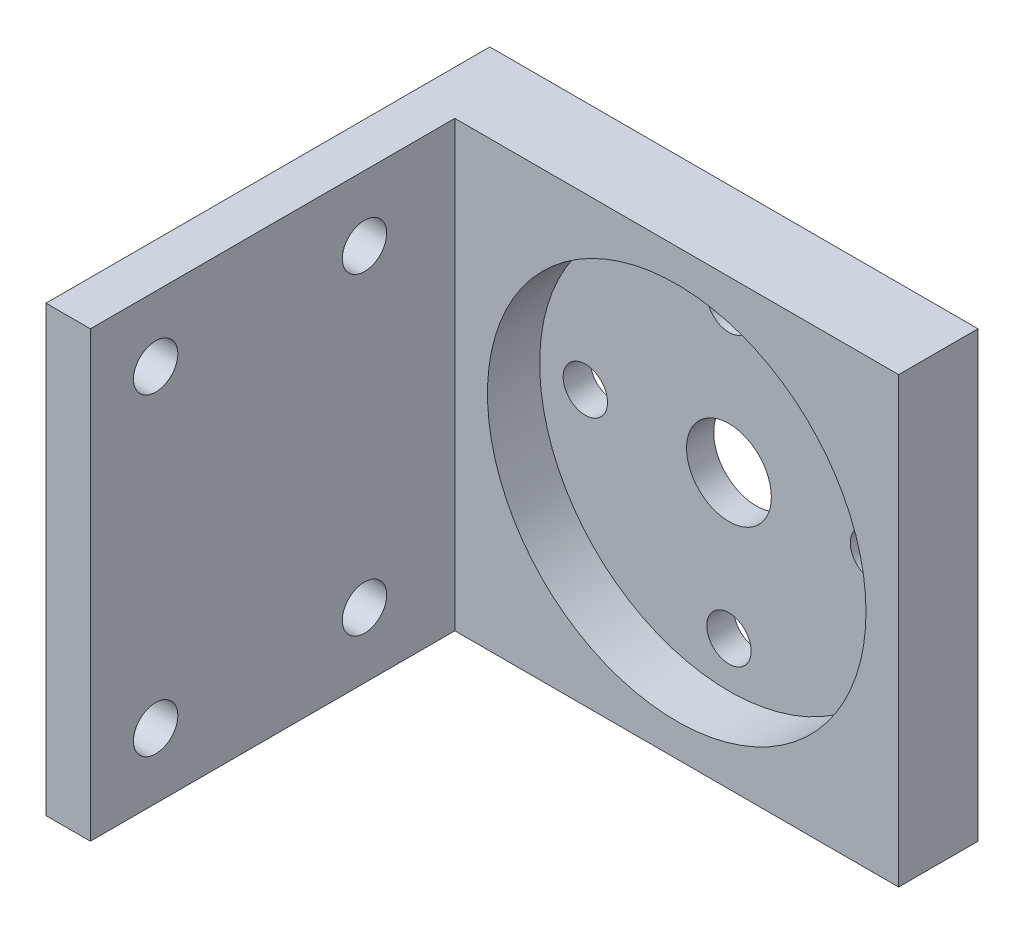
ISO-10303-21;
HEADER;
FILE_DESCRIPTION(('STEP AP214'),'2;1');
FILE_NAME('part.step','',(''),(''),'','','');
FILE_SCHEMA(('AUTOMOTIVE_DESIGN { 1 0 10303 214 1 1 1 1 }'));
ENDSEC;
DATA;
#1=APPLICATION_CONTEXT('core data for automotive mechanical design processes');
#2=APPLICATION_PROTOCOL_DEFINITION('international standard','automotive_design',2000,#1);
#3=PRODUCT_CONTEXT('',#1,'mechanical');
#4=PRODUCT('Part','Part','',(#3));
#5=PRODUCT_RELATED_PRODUCT_CATEGORY('part','',(#4));
#6=PRODUCT_DEFINITION_FORMATION('','',#4);
#7=PRODUCT_DEFINITION_CONTEXT('part definition',#1,'design');
#8=PRODUCT_DEFINITION('design','',#6,#7);
#9=PRODUCT_DEFINITION_SHAPE('','',#8);
#10=(LENGTH_UNIT() NAMED_UNIT(*) SI_UNIT(.MILLI.,.METRE.));
#11=(NAMED_UNIT(*) PLANE_ANGLE_UNIT() SI_UNIT($,.RADIAN.));
#12=(NAMED_UNIT(*) SI_UNIT($,.STERADIAN.) SOLID_ANGLE_UNIT());
#13=UNCERTAINTY_MEASURE_WITH_UNIT(LENGTH_MEASURE(1.E-05),#10,'distance_accuracy_value','');
#14=(GEOMETRIC_REPRESENTATION_CONTEXT(3) GLOBAL_UNCERTAINTY_ASSIGNED_CONTEXT((#13)) GLOBAL_UNIT_ASSIGNED_CONTEXT((#10,
#11,#12)) REPRESENTATION_CONTEXT('',''));
#15=CARTESIAN_POINT('',(0.,0.,0.));
#16=DIRECTION('',(0.,0.,1.));
#17=DIRECTION('',(1.,0.,0.));
#18=AXIS2_PLACEMENT_3D('',#15,#16,#17);
#19=CARTESIAN_POINT('',(0.,0.,6.08));
#20=DIRECTION('',(0.,1.,0.));
#21=DIRECTION('',(0.,0.,1.));
#22=AXIS2_PLACEMENT_3D('',#19,#20,#21);
#23=PLANE('',#22);
#24=DIRECTION('',(1.,0.,0.));
#25=VECTOR('',#24,1.);
#26=CARTESIAN_POINT('',(0.,0.,0.));
#27=LINE('',#26,#25);
#28=CARTESIAN_POINT('',(-37.4,0.,0.));
#29=VERTEX_POINT('',#28);
#30=CARTESIAN_POINT('',(0.,0.,0.));
#31=VERTEX_POINT('',#30);
#32=EDGE_CURVE('E114',#29,#31,#27,.T.);
#33=ORIENTED_EDGE('',*,*,#32,.T.);
#34=DIRECTION('',(0.,0.,-1.));
#35=VECTOR('',#34,1.);
#36=CARTESIAN_POINT('',(0.,0.,6.08));
#37=LINE('',#36,#35);
#38=CARTESIAN_POINT('',(0.,0.,6.08));
#39=VERTEX_POINT('',#38);
#40=EDGE_CURVE('E12',#39,#31,#37,.T.);
#41=ORIENTED_EDGE('',*,*,#40,.F.);
#42=DIRECTION('',(1.,0.,0.));
#43=VECTOR('',#42,1.);
#44=CARTESIAN_POINT('',(0.,0.,6.08));
#45=LINE('',#44,#43);
#46=CARTESIAN_POINT('',(-34.,0.,6.08));
#47=VERTEX_POINT('',#46);
#48=EDGE_CURVE('E106',#47,#39,#45,.T.);
#49=ORIENTED_EDGE('',*,*,#48,.F.);
#50=DIRECTION('',(0.,0.,1.));
#51=VECTOR('',#50,1.);
#52=CARTESIAN_POINT('',(-34.,0.,0.));
#53=LINE('',#52,#51);
#54=CARTESIAN_POINT('',(-34.,0.,34.));
#55=VERTEX_POINT('',#54);
#56=EDGE_CURVE('E69',#47,#55,#53,.T.);
#57=ORIENTED_EDGE('',*,*,#56,.T.);
#58=DIRECTION('',(1.,0.,0.));
#59=VECTOR('',#58,1.);
#60=CARTESIAN_POINT('',(-37.4,0.,34.));
#61=LINE('',#60,#59);
#62=CARTESIAN_POINT('',(-37.4,0.,34.));
#63=VERTEX_POINT('',#62);
#64=EDGE_CURVE('E125',#63,#55,#61,.T.);
#65=ORIENTED_EDGE('',*,*,#64,.F.);
#66=DIRECTION('',(0.,0.,1.));
#67=VECTOR('',#66,1.);
#68=CARTESIAN_POINT('',(-37.4,0.,0.));
#69=LINE('',#68,#67);
#70=EDGE_CURVE('E117',#29,#63,#69,.T.);
#71=ORIENTED_EDGE('',*,*,#70,.F.);
#72=EDGE_LOOP('',(#33,#41,#49,#57,#65,#71));
#73=FACE_BOUND('',#72,.T.);
#74=ADVANCED_FACE('F51',(#73),#23,.F.);
#75=CARTESIAN_POINT('',(0.,0.,6.08));
#76=DIRECTION('',(-1.,0.,0.));
#77=DIRECTION('',(0.,0.,1.));
#78=AXIS2_PLACEMENT_3D('',#75,#76,#77);
#79=PLANE('',#78);
#80=DIRECTION('',(0.,1.,0.));
#81=VECTOR('',#80,1.);
#82=CARTESIAN_POINT('',(0.,0.,0.));
#83=LINE('',#82,#81);
#84=CARTESIAN_POINT('',(0.,34.,0.));
#85=VERTEX_POINT('',#84);
#86=EDGE_CURVE('E82',#31,#85,#83,.T.);
#87=ORIENTED_EDGE('',*,*,#86,.T.);
#88=DIRECTION('',(0.,0.,-1.));
#89=VECTOR('',#88,1.);
#90=CARTESIAN_POINT('',(0.,34.,6.08));
#91=LINE('',#90,#89);
#92=CARTESIAN_POINT('',(0.,34.,6.08));
#93=VERTEX_POINT('',#92);
#94=EDGE_CURVE('E58',#93,#85,#91,.T.);
#95=ORIENTED_EDGE('',*,*,#94,.F.);
#96=DIRECTION('',(0.,1.,0.));
#97=VECTOR('',#96,1.);
#98=CARTESIAN_POINT('',(0.,0.,6.08));
#99=LINE('',#98,#97);
#100=EDGE_CURVE('E92',#39,#93,#99,.T.);
#101=ORIENTED_EDGE('',*,*,#100,.F.);
#102=ORIENTED_EDGE('',*,*,#40,.T.);
#103=EDGE_LOOP('',(#87,#95,#101,#102));
#104=FACE_BOUND('',#103,.T.);
#105=ADVANCED_FACE('F97',(#104),#79,.F.);
#106=CARTESIAN_POINT('',(0.,34.,6.08));
#107=DIRECTION('',(0.,-1.,0.));
#108=DIRECTION('',(0.,0.,-1.));
#109=AXIS2_PLACEMENT_3D('',#106,#107,#108);
#110=PLANE('',#109);
#111=DIRECTION('',(-1.,0.,0.));
#112=VECTOR('',#111,1.);
#113=CARTESIAN_POINT('',(0.,34.,0.));
#114=LINE('',#113,#112);
#115=CARTESIAN_POINT('',(-37.4,34.,0.));
#116=VERTEX_POINT('',#115);
#117=EDGE_CURVE('E115',#85,#116,#114,.T.);
#118=ORIENTED_EDGE('',*,*,#117,.T.);
#119=DIRECTION('',(0.,0.,-1.));
#120=VECTOR('',#119,1.);
#121=CARTESIAN_POINT('',(-37.4,34.,0.));
#122=LINE('',#121,#120);
#123=CARTESIAN_POINT('',(-37.4,34.,34.));
#124=VERTEX_POINT('',#123);
#125=EDGE_CURVE('E157',#124,#116,#122,.T.);
#126=ORIENTED_EDGE('',*,*,#125,.F.);
#127=DIRECTION('',(1.,0.,0.));
#128=VECTOR('',#127,1.);
#129=CARTESIAN_POINT('',(-37.4,34.,34.));
#130=LINE('',#129,#128);
#131=CARTESIAN_POINT('',(-34.,34.,34.));
#132=VERTEX_POINT('',#131);
#133=EDGE_CURVE('E126',#124,#132,#130,.T.);
#134=ORIENTED_EDGE('',*,*,#133,.T.);
#135=DIRECTION('',(0.,0.,-1.));
#136=VECTOR('',#135,1.);
#137=CARTESIAN_POINT('',(-34.,34.,0.));
#138=LINE('',#137,#136);
#139=CARTESIAN_POINT('',(-34.,34.,6.08));
#140=VERTEX_POINT('',#139);
#141=EDGE_CURVE('E149',#132,#140,#138,.T.);
#142=ORIENTED_EDGE('',*,*,#141,.T.);
#143=DIRECTION('',(-1.,0.,0.));
#144=VECTOR('',#143,1.);
#145=CARTESIAN_POINT('',(0.,34.,6.08));
#146=LINE('',#145,#144);
#147=EDGE_CURVE('E102',#93,#140,#146,.T.);
#148=ORIENTED_EDGE('',*,*,#147,.F.);
#149=ORIENTED_EDGE('',*,*,#94,.T.);
#150=EDGE_LOOP('',(#118,#126,#134,#142,#148,#149));
#151=FACE_BOUND('',#150,.T.);
#152=ADVANCED_FACE('F280',(#151),#110,.F.);
#153=CARTESIAN_POINT('',(0.,0.,6.08));
#154=DIRECTION('',(0.,0.,-1.));
#155=DIRECTION('',(-1.,0.,0.));
#156=AXIS2_PLACEMENT_3D('',#153,#154,#155);
#157=PLANE('',#156);
#158=CARTESIAN_POINT('',(-17.,17.,6.08));
#159=DIRECTION('',(0.,0.,1.));
#160=DIRECTION('',(1.,0.,0.));
#161=AXIS2_PLACEMENT_3D('',#158,#159,#160);
#162=CIRCLE('',#161,14.5);
#163=CARTESIAN_POINT('',(-2.5,17.,6.08));
#164=VERTEX_POINT('',#163);
#165=EDGE_CURVE('E201',#164,#164,#162,.T.);
#166=ORIENTED_EDGE('',*,*,#165,.F.);
#167=EDGE_LOOP('',(#166));
#168=FACE_BOUND('',#167,.T.);
#169=ORIENTED_EDGE('',*,*,#48,.T.);
#170=ORIENTED_EDGE('',*,*,#100,.T.);
#171=ORIENTED_EDGE('',*,*,#147,.T.);
#172=DIRECTION('',(0.,-1.,0.));
#173=VECTOR('',#172,1.);
#174=CARTESIAN_POINT('',(-34.,0.,6.08));
#175=LINE('',#174,#173);
#176=EDGE_CURVE('E83',#140,#47,#175,.T.);
#177=ORIENTED_EDGE('',*,*,#176,.T.);
#178=EDGE_LOOP('',(#169,#170,#171,#177));
#179=FACE_BOUND('',#178,.T.);
#180=ADVANCED_FACE('F107',(#168,#179),#157,.F.);
#181=CARTESIAN_POINT('',(0.,0.,0.));
#182=DIRECTION('',(0.,0.,-1.));
#183=DIRECTION('',(-1.,0.,0.));
#184=AXIS2_PLACEMENT_3D('',#181,#182,#183);
#185=PLANE('',#184);
#186=CARTESIAN_POINT('',(-17.,17.,0.));
#187=DIRECTION('',(0.,0.,1.));
#188=DIRECTION('',(1.,0.,0.));
#189=AXIS2_PLACEMENT_3D('',#186,#187,#188);
#190=CIRCLE('',#189,3.25000000000001);
#191=CARTESIAN_POINT('',(-13.75,17.,0.));
#192=VERTEX_POINT('',#191);
#193=EDGE_CURVE('E241',#192,#192,#190,.T.);
#194=ORIENTED_EDGE('',*,*,#193,.T.);
#195=EDGE_LOOP('',(#194));
#196=FACE_BOUND('',#195,.T.);
#197=CARTESIAN_POINT('',(-6.,17.,0.));
#198=DIRECTION('',(0.,0.,1.));
#199=DIRECTION('',(1.,0.,0.));
#200=AXIS2_PLACEMENT_3D('',#197,#198,#199);
#201=CIRCLE('',#200,1.7);
#202=CARTESIAN_POINT('',(-4.3,17.,0.));
#203=VERTEX_POINT('',#202);
#204=EDGE_CURVE('E231',#203,#203,#201,.T.);
#205=ORIENTED_EDGE('',*,*,#204,.T.);
#206=EDGE_LOOP('',(#205));
#207=FACE_BOUND('',#206,.T.);
#208=CARTESIAN_POINT('',(-17.,6.,0.));
#209=DIRECTION('',(0.,0.,1.));
#210=DIRECTION('',(1.,0.,0.));
#211=AXIS2_PLACEMENT_3D('',#208,#209,#210);
#212=CIRCLE('',#211,1.7);
#213=CARTESIAN_POINT('',(-15.3,6.,0.));
#214=VERTEX_POINT('',#213);
#215=EDGE_CURVE('E222',#214,#214,#212,.T.);
#216=ORIENTED_EDGE('',*,*,#215,.T.);
#217=EDGE_LOOP('',(#216));
#218=FACE_BOUND('',#217,.T.);
#219=CARTESIAN_POINT('',(-28.,17.,0.));
#220=DIRECTION('',(0.,0.,1.));
#221=DIRECTION('',(1.,0.,0.));
#222=AXIS2_PLACEMENT_3D('',#219,#220,#221);
#223=CIRCLE('',#222,1.7);
#224=CARTESIAN_POINT('',(-26.3,17.,0.));
#225=VERTEX_POINT('',#224);
#226=EDGE_CURVE('E220',#225,#225,#223,.T.);
#227=ORIENTED_EDGE('',*,*,#226,.T.);
#228=EDGE_LOOP('',(#227));
#229=FACE_BOUND('',#228,.T.);
#230=CARTESIAN_POINT('',(-17.,28.,0.));
#231=DIRECTION('',(0.,0.,1.));
#232=DIRECTION('',(1.,0.,0.));
#233=AXIS2_PLACEMENT_3D('',#230,#231,#232);
#234=CIRCLE('',#233,1.7);
#235=CARTESIAN_POINT('',(-15.3,28.,0.));
#236=VERTEX_POINT('',#235);
#237=EDGE_CURVE('E207',#236,#236,#234,.T.);
#238=ORIENTED_EDGE('',*,*,#237,.T.);
#239=EDGE_LOOP('',(#238));
#240=FACE_BOUND('',#239,.T.);
#241=ORIENTED_EDGE('',*,*,#32,.F.);
#242=DIRECTION('',(0.,-1.,0.));
#243=VECTOR('',#242,1.);
#244=CARTESIAN_POINT('',(-37.4,0.,0.));
#245=LINE('',#244,#243);
#246=EDGE_CURVE('E150',#116,#29,#245,.T.);
#247=ORIENTED_EDGE('',*,*,#246,.F.);
#248=ORIENTED_EDGE('',*,*,#117,.F.);
#249=ORIENTED_EDGE('',*,*,#86,.F.);
#250=EDGE_LOOP('',(#241,#247,#248,#249));
#251=FACE_BOUND('',#250,.T.);
#252=ADVANCED_FACE('F277',(#196,#207,#218,#229,#240,#251),#185,.T.);
#253=CARTESIAN_POINT('',(-37.4,0.,34.));
#254=DIRECTION('',(0.,0.,-1.));
#255=DIRECTION('',(0.,1.,0.));
#256=AXIS2_PLACEMENT_3D('',#253,#254,#255);
#257=PLANE('',#256);
#258=DIRECTION('',(0.,1.,0.));
#259=VECTOR('',#258,1.);
#260=CARTESIAN_POINT('',(-34.,0.,34.));
#261=LINE('',#260,#259);
#262=EDGE_CURVE('E152',#55,#132,#261,.T.);
#263=ORIENTED_EDGE('',*,*,#262,.T.);
#264=ORIENTED_EDGE('',*,*,#133,.F.);
#265=DIRECTION('',(0.,1.,0.));
#266=VECTOR('',#265,1.);
#267=CARTESIAN_POINT('',(-37.4,0.,34.));
#268=LINE('',#267,#266);
#269=EDGE_CURVE('E165',#63,#124,#268,.T.);
#270=ORIENTED_EDGE('',*,*,#269,.F.);
#271=ORIENTED_EDGE('',*,*,#64,.T.);
#272=EDGE_LOOP('',(#263,#264,#270,#271));
#273=FACE_BOUND('',#272,.T.);
#274=ADVANCED_FACE('F284',(#273),#257,.F.);
#275=CARTESIAN_POINT('',(-37.4,0.,0.));
#276=DIRECTION('',(-1.,0.,0.));
#277=DIRECTION('',(0.,0.,1.));
#278=AXIS2_PLACEMENT_3D('',#275,#276,#277);
#279=PLANE('',#278);
#280=CARTESIAN_POINT('',(-37.4,5.,29.));
#281=DIRECTION('',(1.,0.,0.));
#282=DIRECTION('',(0.,0.,-1.));
#283=AXIS2_PLACEMENT_3D('',#280,#281,#282);
#284=CIRCLE('',#283,1.70000000000001);
#285=CARTESIAN_POINT('',(-37.4,5.,27.3));
#286=VERTEX_POINT('',#285);
#287=EDGE_CURVE('E194',#286,#286,#284,.T.);
#288=ORIENTED_EDGE('',*,*,#287,.T.);
#289=EDGE_LOOP('',(#288));
#290=FACE_BOUND('',#289,.T.);
#291=CARTESIAN_POINT('',(-37.4,29.,29.));
#292=DIRECTION('',(1.,0.,0.));
#293=DIRECTION('',(0.,0.,-1.));
#294=AXIS2_PLACEMENT_3D('',#291,#292,#293);
#295=CIRCLE('',#294,1.70000000000001);
#296=CARTESIAN_POINT('',(-37.4,29.,27.3));
#297=VERTEX_POINT('',#296);
#298=EDGE_CURVE('E184',#297,#297,#295,.T.);
#299=ORIENTED_EDGE('',*,*,#298,.T.);
#300=EDGE_LOOP('',(#299));
#301=FACE_BOUND('',#300,.T.);
#302=CARTESIAN_POINT('',(-37.4,5.,13.));
#303=DIRECTION('',(1.,0.,0.));
#304=DIRECTION('',(0.,0.,-1.));
#305=AXIS2_PLACEMENT_3D('',#302,#303,#304);
#306=CIRCLE('',#305,1.70000000000001);
#307=CARTESIAN_POINT('',(-37.4,5.,11.3));
#308=VERTEX_POINT('',#307);
#309=EDGE_CURVE('E180',#308,#308,#306,.T.);
#310=ORIENTED_EDGE('',*,*,#309,.T.);
#311=EDGE_LOOP('',(#310));
#312=FACE_BOUND('',#311,.T.);
#313=CARTESIAN_POINT('',(-37.4,29.,13.));
#314=DIRECTION('',(1.,0.,0.));
#315=DIRECTION('',(0.,0.,-1.));
#316=AXIS2_PLACEMENT_3D('',#313,#314,#315);
#317=CIRCLE('',#316,1.70000000000001);
#318=CARTESIAN_POINT('',(-37.4,29.,11.3));
#319=VERTEX_POINT('',#318);
#320=EDGE_CURVE('E156',#319,#319,#317,.T.);
#321=ORIENTED_EDGE('',*,*,#320,.T.);
#322=EDGE_LOOP('',(#321));
#323=FACE_BOUND('',#322,.T.);
#324=ORIENTED_EDGE('',*,*,#70,.T.);
#325=ORIENTED_EDGE('',*,*,#269,.T.);
#326=ORIENTED_EDGE('',*,*,#125,.T.);
#327=ORIENTED_EDGE('',*,*,#246,.T.);
#328=EDGE_LOOP('',(#324,#325,#326,#327));
#329=FACE_BOUND('',#328,.T.);
#330=ADVANCED_FACE('F335',(#290,#301,#312,#323,#329),#279,.T.);
#331=CARTESIAN_POINT('',(-34.,0.,0.));
#332=DIRECTION('',(-1.,0.,0.));
#333=DIRECTION('',(0.,0.,1.));
#334=AXIS2_PLACEMENT_3D('',#331,#332,#333);
#335=PLANE('',#334);
#336=CARTESIAN_POINT('',(-34.,5.,29.));
#337=DIRECTION('',(1.,0.,0.));
#338=DIRECTION('',(0.,0.,-1.));
#339=AXIS2_PLACEMENT_3D('',#336,#337,#338);
#340=CIRCLE('',#339,1.70000000000001);
#341=CARTESIAN_POINT('',(-34.,5.,27.3));
#342=VERTEX_POINT('',#341);
#343=EDGE_CURVE('E200',#342,#342,#340,.T.);
#344=ORIENTED_EDGE('',*,*,#343,.F.);
#345=EDGE_LOOP('',(#344));
#346=FACE_BOUND('',#345,.T.);
#347=CARTESIAN_POINT('',(-34.,29.,29.));
#348=DIRECTION('',(1.,0.,0.));
#349=DIRECTION('',(0.,0.,-1.));
#350=AXIS2_PLACEMENT_3D('',#347,#348,#349);
#351=CIRCLE('',#350,1.70000000000001);
#352=CARTESIAN_POINT('',(-34.,29.,27.3));
#353=VERTEX_POINT('',#352);
#354=EDGE_CURVE('E186',#353,#353,#351,.T.);
#355=ORIENTED_EDGE('',*,*,#354,.F.);
#356=EDGE_LOOP('',(#355));
#357=FACE_BOUND('',#356,.T.);
#358=CARTESIAN_POINT('',(-34.,5.,13.));
#359=DIRECTION('',(1.,0.,0.));
#360=DIRECTION('',(0.,0.,-1.));
#361=AXIS2_PLACEMENT_3D('',#358,#359,#360);
#362=CIRCLE('',#361,1.70000000000001);
#363=CARTESIAN_POINT('',(-34.,5.,11.3));
#364=VERTEX_POINT('',#363);
#365=EDGE_CURVE('E181',#364,#364,#362,.T.);
#366=ORIENTED_EDGE('',*,*,#365,.F.);
#367=EDGE_LOOP('',(#366));
#368=FACE_BOUND('',#367,.T.);
#369=CARTESIAN_POINT('',(-34.,29.,13.));
#370=DIRECTION('',(1.,0.,0.));
#371=DIRECTION('',(0.,0.,-1.));
#372=AXIS2_PLACEMENT_3D('',#369,#370,#371);
#373=CIRCLE('',#372,1.70000000000001);
#374=CARTESIAN_POINT('',(-34.,29.,11.3));
#375=VERTEX_POINT('',#374);
#376=EDGE_CURVE('E173',#375,#375,#373,.T.);
#377=ORIENTED_EDGE('',*,*,#376,.F.);
#378=EDGE_LOOP('',(#377));
#379=FACE_BOUND('',#378,.T.);
#380=ORIENTED_EDGE('',*,*,#176,.F.);
#381=ORIENTED_EDGE('',*,*,#141,.F.);
#382=ORIENTED_EDGE('',*,*,#262,.F.);
#383=ORIENTED_EDGE('',*,*,#56,.F.);
#384=EDGE_LOOP('',(#380,#381,#382,#383));
#385=FACE_BOUND('',#384,.T.);
#386=ADVANCED_FACE('F345',(#346,#357,#368,#379,#385),#335,.F.);
#387=CARTESIAN_POINT('',(-34.,29.,13.));
#388=DIRECTION('',(1.,0.,0.));
#389=DIRECTION('',(0.,0.,-1.));
#390=AXIS2_PLACEMENT_3D('',#387,#388,#389);
#391=CYLINDRICAL_SURFACE('',#390,1.70000000000001);
#392=ORIENTED_EDGE('',*,*,#320,.F.);
#393=EDGE_LOOP('',(#392));
#394=FACE_BOUND('',#393,.T.);
#395=ORIENTED_EDGE('',*,*,#376,.T.);
#396=EDGE_LOOP('',(#395));
#397=FACE_BOUND('',#396,.T.);
#398=ADVANCED_FACE('F351',(#394,#397),#391,.F.);
#399=CARTESIAN_POINT('',(-34.,5.,13.));
#400=DIRECTION('',(1.,0.,0.));
#401=DIRECTION('',(0.,0.,-1.));
#402=AXIS2_PLACEMENT_3D('',#399,#400,#401);
#403=CYLINDRICAL_SURFACE('',#402,1.70000000000001);
#404=ORIENTED_EDGE('',*,*,#309,.F.);
#405=EDGE_LOOP('',(#404));
#406=FACE_BOUND('',#405,.T.);
#407=ORIENTED_EDGE('',*,*,#365,.T.);
#408=EDGE_LOOP('',(#407));
#409=FACE_BOUND('',#408,.T.);
#410=ADVANCED_FACE('F365',(#406,#409),#403,.F.);
#411=CARTESIAN_POINT('',(-34.,29.,29.));
#412=DIRECTION('',(1.,0.,0.));
#413=DIRECTION('',(0.,0.,-1.));
#414=AXIS2_PLACEMENT_3D('',#411,#412,#413);
#415=CYLINDRICAL_SURFACE('',#414,1.70000000000001);
#416=ORIENTED_EDGE('',*,*,#298,.F.);
#417=EDGE_LOOP('',(#416));
#418=FACE_BOUND('',#417,.T.);
#419=ORIENTED_EDGE('',*,*,#354,.T.);
#420=EDGE_LOOP('',(#419));
#421=FACE_BOUND('',#420,.T.);
#422=ADVANCED_FACE('F375',(#418,#421),#415,.F.);
#423=CARTESIAN_POINT('',(-34.,5.,29.));
#424=DIRECTION('',(1.,0.,0.));
#425=DIRECTION('',(0.,0.,-1.));
#426=AXIS2_PLACEMENT_3D('',#423,#424,#425);
#427=CYLINDRICAL_SURFACE('',#426,1.70000000000001);
#428=ORIENTED_EDGE('',*,*,#287,.F.);
#429=EDGE_LOOP('',(#428));
#430=FACE_BOUND('',#429,.T.);
#431=ORIENTED_EDGE('',*,*,#343,.T.);
#432=EDGE_LOOP('',(#431));
#433=FACE_BOUND('',#432,.T.);
#434=ADVANCED_FACE('F272',(#430,#433),#427,.F.);
#435=CARTESIAN_POINT('',(-17.,17.,2.08));
#436=DIRECTION('',(0.,0.,1.));
#437=DIRECTION('',(1.,0.,0.));
#438=AXIS2_PLACEMENT_3D('',#435,#436,#437);
#439=CYLINDRICAL_SURFACE('',#438,14.5);
#440=CARTESIAN_POINT('',(-17.,17.,2.08));
#441=DIRECTION('',(0.,0.,1.));
#442=DIRECTION('',(1.,0.,0.));
#443=AXIS2_PLACEMENT_3D('',#440,#441,#442);
#444=CIRCLE('',#443,14.5);
#445=CARTESIAN_POINT('',(-2.5,17.,2.08));
#446=VERTEX_POINT('',#445);
#447=EDGE_CURVE('E204',#446,#446,#444,.T.);
#448=ORIENTED_EDGE('',*,*,#447,.F.);
#449=EDGE_LOOP('',(#448));
#450=FACE_BOUND('',#449,.T.);
#451=ORIENTED_EDGE('',*,*,#165,.T.);
#452=EDGE_LOOP('',(#451));
#453=FACE_BOUND('',#452,.T.);
#454=ADVANCED_FACE('F260',(#450,#453),#439,.F.);
#455=CARTESIAN_POINT('',(-17.,17.,2.08));
#456=DIRECTION('',(0.,0.,1.));
#457=DIRECTION('',(1.,0.,0.));
#458=AXIS2_PLACEMENT_3D('',#455,#456,#457);
#459=PLANE('',#458);
#460=CARTESIAN_POINT('',(-17.,17.,2.08));
#461=DIRECTION('',(0.,0.,1.));
#462=DIRECTION('',(1.,0.,0.));
#463=AXIS2_PLACEMENT_3D('',#460,#461,#462);
#464=CIRCLE('',#463,3.25000000000001);
#465=CARTESIAN_POINT('',(-13.75,17.,2.08));
#466=VERTEX_POINT('',#465);
#467=EDGE_CURVE('E244',#466,#466,#464,.T.);
#468=ORIENTED_EDGE('',*,*,#467,.F.);
#469=EDGE_LOOP('',(#468));
#470=FACE_BOUND('',#469,.T.);
#471=CARTESIAN_POINT('',(-6.,17.,2.08));
#472=DIRECTION('',(0.,0.,1.));
#473=DIRECTION('',(1.,0.,0.));
#474=AXIS2_PLACEMENT_3D('',#471,#472,#473);
#475=CIRCLE('',#474,1.7);
#476=CARTESIAN_POINT('',(-4.3,17.,2.08));
#477=VERTEX_POINT('',#476);
#478=EDGE_CURVE('E240',#477,#477,#475,.T.);
#479=ORIENTED_EDGE('',*,*,#478,.F.);
#480=EDGE_LOOP('',(#479));
#481=FACE_BOUND('',#480,.T.);
#482=CARTESIAN_POINT('',(-17.,6.,2.08));
#483=DIRECTION('',(0.,0.,1.));
#484=DIRECTION('',(1.,0.,0.));
#485=AXIS2_PLACEMENT_3D('',#482,#483,#484);
#486=CIRCLE('',#485,1.7);
#487=CARTESIAN_POINT('',(-15.3,6.,2.08));
#488=VERTEX_POINT('',#487);
#489=EDGE_CURVE('E230',#488,#488,#486,.T.);
#490=ORIENTED_EDGE('',*,*,#489,.F.);
#491=EDGE_LOOP('',(#490));
#492=FACE_BOUND('',#491,.T.);
#493=CARTESIAN_POINT('',(-28.,17.,2.08));
#494=DIRECTION('',(0.,0.,1.));
#495=DIRECTION('',(1.,0.,0.));
#496=AXIS2_PLACEMENT_3D('',#493,#494,#495);
#497=CIRCLE('',#496,1.7);
#498=CARTESIAN_POINT('',(-26.3,17.,2.08));
#499=VERTEX_POINT('',#498);
#500=EDGE_CURVE('E224',#499,#499,#497,.T.);
#501=ORIENTED_EDGE('',*,*,#500,.F.);
#502=EDGE_LOOP('',(#501));
#503=FACE_BOUND('',#502,.T.);
#504=CARTESIAN_POINT('',(-17.,28.,2.08));
#505=DIRECTION('',(0.,0.,1.));
#506=DIRECTION('',(1.,0.,0.));
#507=AXIS2_PLACEMENT_3D('',#504,#505,#506);
#508=CIRCLE('',#507,1.7);
#509=CARTESIAN_POINT('',(-15.3,28.,2.08));
#510=VERTEX_POINT('',#509);
#511=EDGE_CURVE('E214',#510,#510,#508,.T.);
#512=ORIENTED_EDGE('',*,*,#511,.F.);
#513=EDGE_LOOP('',(#512));
#514=FACE_BOUND('',#513,.T.);
#515=ORIENTED_EDGE('',*,*,#447,.T.);
#516=EDGE_LOOP('',(#515));
#517=FACE_BOUND('',#516,.T.);
#518=ADVANCED_FACE('F254',(#470,#481,#492,#503,#514,#517),#459,.T.);
#519=CARTESIAN_POINT('',(-17.,28.,2.08));
#520=DIRECTION('',(0.,0.,1.));
#521=DIRECTION('',(1.,0.,0.));
#522=AXIS2_PLACEMENT_3D('',#519,#520,#521);
#523=CYLINDRICAL_SURFACE('',#522,1.7);
#524=ORIENTED_EDGE('',*,*,#237,.F.);
#525=EDGE_LOOP('',(#524));
#526=FACE_BOUND('',#525,.T.);
#527=ORIENTED_EDGE('',*,*,#511,.T.);
#528=EDGE_LOOP('',(#527));
#529=FACE_BOUND('',#528,.T.);
#530=ADVANCED_FACE('F257',(#526,#529),#523,.F.);
#531=CARTESIAN_POINT('',(-28.,17.,2.08));
#532=DIRECTION('',(0.,0.,1.));
#533=DIRECTION('',(1.,0.,0.));
#534=AXIS2_PLACEMENT_3D('',#531,#532,#533);
#535=CYLINDRICAL_SURFACE('',#534,1.7);
#536=ORIENTED_EDGE('',*,*,#226,.F.);
#537=EDGE_LOOP('',(#536));
#538=FACE_BOUND('',#537,.T.);
#539=ORIENTED_EDGE('',*,*,#500,.T.);
#540=EDGE_LOOP('',(#539));
#541=FACE_BOUND('',#540,.T.);
#542=ADVANCED_FACE('F415',(#538,#541),#535,.F.);
#543=CARTESIAN_POINT('',(-17.,6.,2.08));
#544=DIRECTION('',(0.,0.,1.));
#545=DIRECTION('',(1.,0.,0.));
#546=AXIS2_PLACEMENT_3D('',#543,#544,#545);
#547=CYLINDRICAL_SURFACE('',#546,1.7);
#548=ORIENTED_EDGE('',*,*,#215,.F.);
#549=EDGE_LOOP('',(#548));
#550=FACE_BOUND('',#549,.T.);
#551=ORIENTED_EDGE('',*,*,#489,.T.);
#552=EDGE_LOOP('',(#551));
#553=FACE_BOUND('',#552,.T.);
#554=ADVANCED_FACE('F422',(#550,#553),#547,.F.);
#555=CARTESIAN_POINT('',(-6.,17.,2.08));
#556=DIRECTION('',(0.,0.,1.));
#557=DIRECTION('',(1.,0.,0.));
#558=AXIS2_PLACEMENT_3D('',#555,#556,#557);
#559=CYLINDRICAL_SURFACE('',#558,1.7);
#560=ORIENTED_EDGE('',*,*,#204,.F.);
#561=EDGE_LOOP('',(#560));
#562=FACE_BOUND('',#561,.T.);
#563=ORIENTED_EDGE('',*,*,#478,.T.);
#564=EDGE_LOOP('',(#563));
#565=FACE_BOUND('',#564,.T.);
#566=ADVANCED_FACE('F435',(#562,#565),#559,.F.);
#567=CARTESIAN_POINT('',(-17.,17.,2.08));
#568=DIRECTION('',(0.,0.,1.));
#569=DIRECTION('',(1.,0.,0.));
#570=AXIS2_PLACEMENT_3D('',#567,#568,#569);
#571=CYLINDRICAL_SURFACE('',#570,3.25000000000001);
#572=ORIENTED_EDGE('',*,*,#193,.F.);
#573=EDGE_LOOP('',(#572));
#574=FACE_BOUND('',#573,.T.);
#575=ORIENTED_EDGE('',*,*,#467,.T.);
#576=EDGE_LOOP('',(#575));
#577=FACE_BOUND('',#576,.T.);
#578=ADVANCED_FACE('F252',(#574,#577),#571,.F.);
#579=CLOSED_SHELL('',(#74,#105,#152,#180,#252,#274,#330,#386,#398,#410,#422,#434,#454,#518,#530,
#542,#554,#566,#578));
#580=MANIFOLD_SOLID_BREP('B2',#579);
#581=ADVANCED_BREP_SHAPE_REPRESENTATION('',(#18,#580),#14);
#582=SHAPE_DEFINITION_REPRESENTATION(#9,#581);
ENDSEC;
END-ISO-10303-21;
